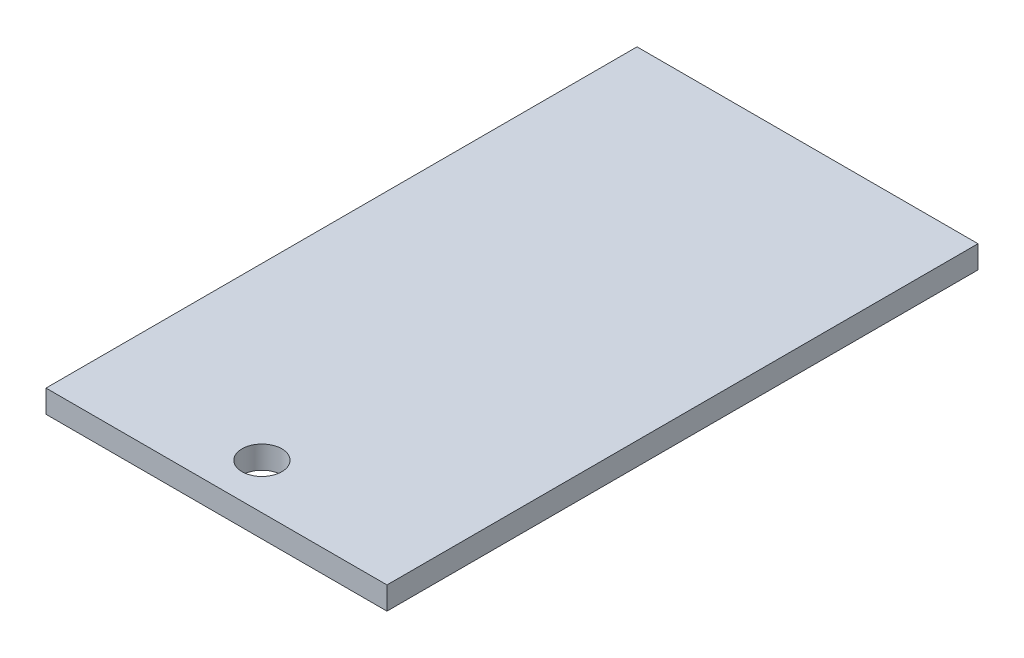
ISO-10303-21;
HEADER;
FILE_DESCRIPTION(('STEP AP214'),'2;1');
FILE_NAME('part.step','',(''),(''),'','','');
FILE_SCHEMA(('AUTOMOTIVE_DESIGN { 1 0 10303 214 1 1 1 1 }'));
ENDSEC;
DATA;
#1=APPLICATION_CONTEXT('core data for automotive mechanical design processes');
#2=APPLICATION_PROTOCOL_DEFINITION('international standard','automotive_design',2000,#1);
#3=PRODUCT_CONTEXT('',#1,'mechanical');
#4=PRODUCT('Part','Part','',(#3));
#5=PRODUCT_RELATED_PRODUCT_CATEGORY('part','',(#4));
#6=PRODUCT_DEFINITION_FORMATION('','',#4);
#7=PRODUCT_DEFINITION_CONTEXT('part definition',#1,'design');
#8=PRODUCT_DEFINITION('design','',#6,#7);
#9=PRODUCT_DEFINITION_SHAPE('','',#8);
#10=(LENGTH_UNIT() NAMED_UNIT(*) SI_UNIT(.MILLI.,.METRE.));
#11=(NAMED_UNIT(*) PLANE_ANGLE_UNIT() SI_UNIT($,.RADIAN.));
#12=(NAMED_UNIT(*) SI_UNIT($,.STERADIAN.) SOLID_ANGLE_UNIT());
#13=UNCERTAINTY_MEASURE_WITH_UNIT(LENGTH_MEASURE(1.E-05),#10,'distance_accuracy_value','');
#14=(GEOMETRIC_REPRESENTATION_CONTEXT(3) GLOBAL_UNCERTAINTY_ASSIGNED_CONTEXT((#13)) GLOBAL_UNIT_ASSIGNED_CONTEXT((#10,
#11,#12)) REPRESENTATION_CONTEXT('',''));
#15=CARTESIAN_POINT('',(0.,0.,0.));
#16=DIRECTION('',(0.,0.,1.));
#17=DIRECTION('',(1.,0.,0.));
#18=AXIS2_PLACEMENT_3D('',#15,#16,#17);
#19=CARTESIAN_POINT('',(0.,340.,0.));
#20=DIRECTION('',(0.,-1.,0.));
#21=DIRECTION('',(0.,0.,-1.));
#22=AXIS2_PLACEMENT_3D('',#19,#20,#21);
#23=PLANE('',#22);
#24=DIRECTION('',(-1.,0.,0.));
#25=VECTOR('',#24,1.);
#26=CARTESIAN_POINT('',(-550.,340.,130.));
#27=LINE('',#26,#25);
#28=CARTESIAN_POINT('',(-700.,340.,130.));
#29=VERTEX_POINT('',#28);
#30=CARTESIAN_POINT('',(-550.,340.,130.));
#31=VERTEX_POINT('',#30);
#32=EDGE_CURVE('E87',#29,#31,#27,.F.);
#33=ORIENTED_EDGE('',*,*,#32,.T.);
#34=DIRECTION('',(0.,0.,1.));
#35=VECTOR('',#34,1.);
#36=CARTESIAN_POINT('',(-550.,340.,-130.));
#37=LINE('',#36,#35);
#38=CARTESIAN_POINT('',(-550.,340.,-130.));
#39=VERTEX_POINT('',#38);
#40=EDGE_CURVE('E54',#31,#39,#37,.F.);
#41=ORIENTED_EDGE('',*,*,#40,.T.);
#42=DIRECTION('',(1.,0.,0.));
#43=VECTOR('',#42,1.);
#44=CARTESIAN_POINT('',(-550.,340.,-130.));
#45=LINE('',#44,#43);
#46=CARTESIAN_POINT('',(-700.,340.,-130.));
#47=VERTEX_POINT('',#46);
#48=EDGE_CURVE('E56',#39,#47,#45,.F.);
#49=ORIENTED_EDGE('',*,*,#48,.T.);
#50=DIRECTION('',(0.,0.,1.));
#51=VECTOR('',#50,1.);
#52=CARTESIAN_POINT('',(-700.,340.,-130.));
#53=LINE('',#52,#51);
#54=EDGE_CURVE('E59',#47,#29,#53,.T.);
#55=ORIENTED_EDGE('',*,*,#54,.T.);
#56=EDGE_LOOP('',(#33,#41,#49,#55));
#57=FACE_BOUND('',#56,.T.);
#58=CARTESIAN_POINT('',(-625.,340.,110.));
#59=DIRECTION('',(0.,1.,0.));
#60=DIRECTION('',(0.,0.,1.));
#61=AXIS2_PLACEMENT_3D('',#58,#59,#60);
#62=CIRCLE('',#61,8.75000000000004);
#63=CARTESIAN_POINT('',(-625.,340.,118.75));
#64=VERTEX_POINT('',#63);
#65=EDGE_CURVE('E19',#64,#64,#62,.F.);
#66=ORIENTED_EDGE('',*,*,#65,.T.);
#67=EDGE_LOOP('',(#66));
#68=FACE_BOUND('',#67,.T.);
#69=ADVANCED_FACE('F16',(#57,#68),#23,.F.);
#70=CARTESIAN_POINT('',(-625.,340.,110.));
#71=DIRECTION('',(0.,1.,0.));
#72=DIRECTION('',(0.,0.,1.));
#73=AXIS2_PLACEMENT_3D('',#70,#71,#72);
#74=CYLINDRICAL_SURFACE('',#73,8.75000000000004);
#75=CARTESIAN_POINT('',(-625.,330.,110.));
#76=DIRECTION('',(0.,1.,0.));
#77=DIRECTION('',(0.,0.,1.));
#78=AXIS2_PLACEMENT_3D('',#75,#76,#77);
#79=CIRCLE('',#78,8.75000000000004);
#80=CARTESIAN_POINT('',(-625.,330.,118.75));
#81=VERTEX_POINT('',#80);
#82=EDGE_CURVE('E81',#81,#81,#79,.T.);
#83=ORIENTED_EDGE('',*,*,#82,.F.);
#84=EDGE_LOOP('',(#83));
#85=FACE_BOUND('',#84,.T.);
#86=ORIENTED_EDGE('',*,*,#65,.F.);
#87=EDGE_LOOP('',(#86));
#88=FACE_BOUND('',#87,.T.);
#89=ADVANCED_FACE('F112',(#85,#88),#74,.F.);
#90=CARTESIAN_POINT('',(-700.,340.,-130.));
#91=DIRECTION('',(1.,0.,0.));
#92=DIRECTION('',(0.,1.,0.));
#93=AXIS2_PLACEMENT_3D('',#90,#91,#92);
#94=PLANE('',#93);
#95=DIRECTION('',(0.,1.,0.));
#96=VECTOR('',#95,1.);
#97=CARTESIAN_POINT('',(-700.,340.,130.));
#98=LINE('',#97,#96);
#99=CARTESIAN_POINT('',(-700.,330.,130.));
#100=VERTEX_POINT('',#99);
#101=EDGE_CURVE('E70',#100,#29,#98,.T.);
#102=ORIENTED_EDGE('',*,*,#101,.T.);
#103=ORIENTED_EDGE('',*,*,#54,.F.);
#104=DIRECTION('',(0.,1.,0.));
#105=VECTOR('',#104,1.);
#106=CARTESIAN_POINT('',(-700.,340.,-130.));
#107=LINE('',#106,#105);
#108=CARTESIAN_POINT('',(-700.,330.,-130.));
#109=VERTEX_POINT('',#108);
#110=EDGE_CURVE('E64',#47,#109,#107,.F.);
#111=ORIENTED_EDGE('',*,*,#110,.T.);
#112=DIRECTION('',(0.,0.,-1.));
#113=VECTOR('',#112,1.);
#114=CARTESIAN_POINT('',(-700.,330.,0.));
#115=LINE('',#114,#113);
#116=EDGE_CURVE('E83',#100,#109,#115,.T.);
#117=ORIENTED_EDGE('',*,*,#116,.F.);
#118=EDGE_LOOP('',(#102,#103,#111,#117));
#119=FACE_BOUND('',#118,.T.);
#120=ADVANCED_FACE('F67',(#119),#94,.F.);
#121=CARTESIAN_POINT('',(-550.,340.,-130.));
#122=DIRECTION('',(0.,0.,1.));
#123=DIRECTION('',(1.,0.,0.));
#124=AXIS2_PLACEMENT_3D('',#121,#122,#123);
#125=PLANE('',#124);
#126=ORIENTED_EDGE('',*,*,#110,.F.);
#127=ORIENTED_EDGE('',*,*,#48,.F.);
#128=DIRECTION('',(0.,-1.,0.));
#129=VECTOR('',#128,1.);
#130=CARTESIAN_POINT('',(-550.,340.,-130.));
#131=LINE('',#130,#129);
#132=CARTESIAN_POINT('',(-550.,330.,-130.));
#133=VERTEX_POINT('',#132);
#134=EDGE_CURVE('E78',#39,#133,#131,.T.);
#135=ORIENTED_EDGE('',*,*,#134,.T.);
#136=DIRECTION('',(1.,0.,0.));
#137=VECTOR('',#136,1.);
#138=CARTESIAN_POINT('',(0.,330.,-130.));
#139=LINE('',#138,#137);
#140=EDGE_CURVE('E75',#109,#133,#139,.T.);
#141=ORIENTED_EDGE('',*,*,#140,.F.);
#142=EDGE_LOOP('',(#126,#127,#135,#141));
#143=FACE_BOUND('',#142,.T.);
#144=ADVANCED_FACE('F73',(#143),#125,.F.);
#145=CARTESIAN_POINT('',(-550.,340.,-130.));
#146=DIRECTION('',(-1.,0.,0.));
#147=DIRECTION('',(0.,-1.,0.));
#148=AXIS2_PLACEMENT_3D('',#145,#146,#147);
#149=PLANE('',#148);
#150=ORIENTED_EDGE('',*,*,#134,.F.);
#151=ORIENTED_EDGE('',*,*,#40,.F.);
#152=DIRECTION('',(0.,1.,0.));
#153=VECTOR('',#152,1.);
#154=CARTESIAN_POINT('',(-550.,340.,130.));
#155=LINE('',#154,#153);
#156=CARTESIAN_POINT('',(-550.,330.,130.));
#157=VERTEX_POINT('',#156);
#158=EDGE_CURVE('E34',#31,#157,#155,.F.);
#159=ORIENTED_EDGE('',*,*,#158,.T.);
#160=DIRECTION('',(0.,0.,-1.));
#161=VECTOR('',#160,1.);
#162=CARTESIAN_POINT('',(-550.,330.,0.));
#163=LINE('',#162,#161);
#164=EDGE_CURVE('E25',#133,#157,#163,.F.);
#165=ORIENTED_EDGE('',*,*,#164,.F.);
#166=EDGE_LOOP('',(#150,#151,#159,#165));
#167=FACE_BOUND('',#166,.T.);
#168=ADVANCED_FACE('F93',(#167),#149,.F.);
#169=CARTESIAN_POINT('',(-550.,340.,130.));
#170=DIRECTION('',(0.,0.,-1.));
#171=DIRECTION('',(-1.,0.,0.));
#172=AXIS2_PLACEMENT_3D('',#169,#170,#171);
#173=PLANE('',#172);
#174=ORIENTED_EDGE('',*,*,#158,.F.);
#175=ORIENTED_EDGE('',*,*,#32,.F.);
#176=ORIENTED_EDGE('',*,*,#101,.F.);
#177=DIRECTION('',(1.,0.,0.));
#178=VECTOR('',#177,1.);
#179=CARTESIAN_POINT('',(0.,330.,130.));
#180=LINE('',#179,#178);
#181=EDGE_CURVE('E11',#157,#100,#180,.F.);
#182=ORIENTED_EDGE('',*,*,#181,.F.);
#183=EDGE_LOOP('',(#174,#175,#176,#182));
#184=FACE_BOUND('',#183,.T.);
#185=ADVANCED_FACE('F98',(#184),#173,.F.);
#186=CARTESIAN_POINT('',(0.,330.,0.));
#187=DIRECTION('',(0.,-1.,0.));
#188=DIRECTION('',(0.,0.,-1.));
#189=AXIS2_PLACEMENT_3D('',#186,#187,#188);
#190=PLANE('',#189);
#191=ORIENTED_EDGE('',*,*,#164,.T.);
#192=ORIENTED_EDGE('',*,*,#181,.T.);
#193=ORIENTED_EDGE('',*,*,#116,.T.);
#194=ORIENTED_EDGE('',*,*,#140,.T.);
#195=EDGE_LOOP('',(#191,#192,#193,#194));
#196=FACE_BOUND('',#195,.T.);
#197=ORIENTED_EDGE('',*,*,#82,.T.);
#198=EDGE_LOOP('',(#197));
#199=FACE_BOUND('',#198,.T.);
#200=ADVANCED_FACE('F96',(#196,#199),#190,.T.);
#201=CLOSED_SHELL('',(#69,#89,#120,#144,#168,#185,#200));
#202=MANIFOLD_SOLID_BREP('B1',#201);
#203=ADVANCED_BREP_SHAPE_REPRESENTATION('',(#18,#202),#14);
#204=SHAPE_DEFINITION_REPRESENTATION(#9,#203);
ENDSEC;
END-ISO-10303-21;
